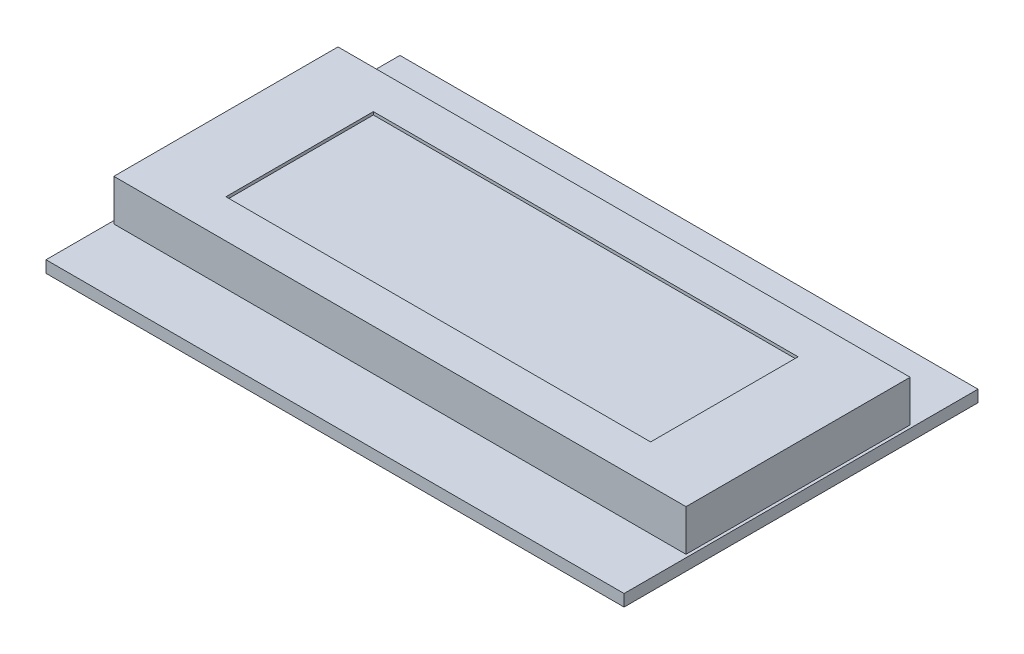
ISO-10303-21;
HEADER;
FILE_DESCRIPTION(('STEP AP214'),'2;1');
FILE_NAME('part.step','',(''),(''),'','','');
FILE_SCHEMA(('AUTOMOTIVE_DESIGN { 1 0 10303 214 1 1 1 1 }'));
ENDSEC;
DATA;
#1=APPLICATION_CONTEXT('core data for automotive mechanical design processes');
#2=APPLICATION_PROTOCOL_DEFINITION('international standard','automotive_design',2000,#1);
#3=PRODUCT_CONTEXT('',#1,'mechanical');
#4=PRODUCT('Part','Part','',(#3));
#5=PRODUCT_RELATED_PRODUCT_CATEGORY('part','',(#4));
#6=PRODUCT_DEFINITION_FORMATION('','',#4);
#7=PRODUCT_DEFINITION_CONTEXT('part definition',#1,'design');
#8=PRODUCT_DEFINITION('design','',#6,#7);
#9=PRODUCT_DEFINITION_SHAPE('','',#8);
#10=(LENGTH_UNIT() NAMED_UNIT(*) SI_UNIT(.MILLI.,.METRE.));
#11=(NAMED_UNIT(*) PLANE_ANGLE_UNIT() SI_UNIT($,.RADIAN.));
#12=(NAMED_UNIT(*) SI_UNIT($,.STERADIAN.) SOLID_ANGLE_UNIT());
#13=UNCERTAINTY_MEASURE_WITH_UNIT(LENGTH_MEASURE(1.E-05),#10,'distance_accuracy_value','');
#14=(GEOMETRIC_REPRESENTATION_CONTEXT(3) GLOBAL_UNCERTAINTY_ASSIGNED_CONTEXT((#13)) GLOBAL_UNIT_ASSIGNED_CONTEXT((#10,
#11,#12)) REPRESENTATION_CONTEXT('',''));
#15=CARTESIAN_POINT('',(0.,0.,0.));
#16=DIRECTION('',(0.,0.,1.));
#17=DIRECTION('',(1.,0.,0.));
#18=AXIS2_PLACEMENT_3D('',#15,#16,#17);
#19=CARTESIAN_POINT('',(0.,2.,0.));
#20=DIRECTION('',(0.,-1.,0.));
#21=DIRECTION('',(0.,0.,-1.));
#22=AXIS2_PLACEMENT_3D('',#19,#20,#21);
#23=PLANE('',#22);
#24=DIRECTION('',(0.,0.,-1.));
#25=VECTOR('',#24,1.);
#26=CARTESIAN_POINT('',(49.0000000000001,2.,30.));
#27=LINE('',#26,#25);
#28=CARTESIAN_POINT('',(49.0000000000001,2.,30.));
#29=VERTEX_POINT('',#28);
#30=CARTESIAN_POINT('',(49.0000000000001,2.,-29.9999999999999));
#31=VERTEX_POINT('',#30);
#32=EDGE_CURVE('E205',#29,#31,#27,.T.);
#33=ORIENTED_EDGE('',*,*,#32,.T.);
#34=DIRECTION('',(-1.,0.,0.));
#35=VECTOR('',#34,1.);
#36=CARTESIAN_POINT('',(-48.9999999999999,2.,-29.9999999999999));
#37=LINE('',#36,#35);
#38=CARTESIAN_POINT('',(-48.9999999999999,2.,-29.9999999999999));
#39=VERTEX_POINT('',#38);
#40=EDGE_CURVE('E208',#31,#39,#37,.T.);
#41=ORIENTED_EDGE('',*,*,#40,.T.);
#42=DIRECTION('',(0.,0.,1.));
#43=VECTOR('',#42,1.);
#44=CARTESIAN_POINT('',(-48.9999999999999,2.,30.));
#45=LINE('',#44,#43);
#46=CARTESIAN_POINT('',(-48.9999999999999,2.,30.));
#47=VERTEX_POINT('',#46);
#48=EDGE_CURVE('E211',#39,#47,#45,.T.);
#49=ORIENTED_EDGE('',*,*,#48,.T.);
#50=DIRECTION('',(1.,0.,0.));
#51=VECTOR('',#50,1.);
#52=CARTESIAN_POINT('',(-48.9999999999999,2.,30.));
#53=LINE('',#52,#51);
#54=EDGE_CURVE('E213',#47,#29,#53,.T.);
#55=ORIENTED_EDGE('',*,*,#54,.T.);
#56=EDGE_LOOP('',(#33,#41,#49,#55));
#57=FACE_BOUND('',#56,.T.);
#58=DIRECTION('',(0.,0.,-1.));
#59=VECTOR('',#58,1.);
#60=CARTESIAN_POINT('',(48.5,2.,19.));
#61=LINE('',#60,#59);
#62=CARTESIAN_POINT('',(48.5,2.,19.));
#63=VERTEX_POINT('',#62);
#64=CARTESIAN_POINT('',(48.5,2.,-19.));
#65=VERTEX_POINT('',#64);
#66=EDGE_CURVE('E70',#63,#65,#61,.T.);
#67=ORIENTED_EDGE('',*,*,#66,.F.);
#68=DIRECTION('',(1.,0.,0.));
#69=VECTOR('',#68,1.);
#70=CARTESIAN_POINT('',(-48.5,2.,19.));
#71=LINE('',#70,#69);
#72=CARTESIAN_POINT('',(-48.5,2.,19.));
#73=VERTEX_POINT('',#72);
#74=EDGE_CURVE('E178',#73,#63,#71,.T.);
#75=ORIENTED_EDGE('',*,*,#74,.F.);
#76=DIRECTION('',(0.,0.,1.));
#77=VECTOR('',#76,1.);
#78=CARTESIAN_POINT('',(-48.5,2.,19.));
#79=LINE('',#78,#77);
#80=CARTESIAN_POINT('',(-48.5,2.,-19.));
#81=VERTEX_POINT('',#80);
#82=EDGE_CURVE('E189',#81,#73,#79,.T.);
#83=ORIENTED_EDGE('',*,*,#82,.F.);
#84=DIRECTION('',(-1.,0.,0.));
#85=VECTOR('',#84,1.);
#86=CARTESIAN_POINT('',(-48.5,2.,-19.));
#87=LINE('',#86,#85);
#88=EDGE_CURVE('E186',#65,#81,#87,.T.);
#89=ORIENTED_EDGE('',*,*,#88,.F.);
#90=EDGE_LOOP('',(#67,#75,#83,#89));
#91=FACE_BOUND('',#90,.T.);
#92=ADVANCED_FACE('F47',(#57,#91),#23,.F.);
#93=CARTESIAN_POINT('',(49.0000000000001,2.,30.));
#94=DIRECTION('',(-1.,0.,0.));
#95=DIRECTION('',(0.,0.,1.));
#96=AXIS2_PLACEMENT_3D('',#93,#94,#95);
#97=PLANE('',#96);
#98=DIRECTION('',(0.,0.,-1.));
#99=VECTOR('',#98,1.);
#100=CARTESIAN_POINT('',(49.0000000000001,0.,30.));
#101=LINE('',#100,#99);
#102=CARTESIAN_POINT('',(49.0000000000001,0.,30.));
#103=VERTEX_POINT('',#102);
#104=CARTESIAN_POINT('',(49.0000000000001,0.,-29.9999999999999));
#105=VERTEX_POINT('',#104);
#106=EDGE_CURVE('E204',#103,#105,#101,.T.);
#107=ORIENTED_EDGE('',*,*,#106,.T.);
#108=DIRECTION('',(0.,-1.,0.));
#109=VECTOR('',#108,1.);
#110=CARTESIAN_POINT('',(49.0000000000001,2.,-29.9999999999999));
#111=LINE('',#110,#109);
#112=EDGE_CURVE('E11',#31,#105,#111,.T.);
#113=ORIENTED_EDGE('',*,*,#112,.F.);
#114=ORIENTED_EDGE('',*,*,#32,.F.);
#115=DIRECTION('',(0.,-1.,0.));
#116=VECTOR('',#115,1.);
#117=CARTESIAN_POINT('',(49.0000000000001,2.,30.));
#118=LINE('',#117,#116);
#119=EDGE_CURVE('E215',#29,#103,#118,.T.);
#120=ORIENTED_EDGE('',*,*,#119,.T.);
#121=EDGE_LOOP('',(#107,#113,#114,#120));
#122=FACE_BOUND('',#121,.T.);
#123=ADVANCED_FACE('F49',(#122),#97,.F.);
#124=CARTESIAN_POINT('',(-48.9999999999999,2.,-29.9999999999999));
#125=DIRECTION('',(0.,0.,1.));
#126=DIRECTION('',(1.,0.,0.));
#127=AXIS2_PLACEMENT_3D('',#124,#125,#126);
#128=PLANE('',#127);
#129=DIRECTION('',(-1.,0.,0.));
#130=VECTOR('',#129,1.);
#131=CARTESIAN_POINT('',(-48.9999999999999,0.,-29.9999999999999));
#132=LINE('',#131,#130);
#133=CARTESIAN_POINT('',(-48.9999999999999,0.,-29.9999999999999));
#134=VERTEX_POINT('',#133);
#135=EDGE_CURVE('E218',#105,#134,#132,.T.);
#136=ORIENTED_EDGE('',*,*,#135,.T.);
#137=DIRECTION('',(0.,-1.,0.));
#138=VECTOR('',#137,1.);
#139=CARTESIAN_POINT('',(-48.9999999999999,2.,-29.9999999999999));
#140=LINE('',#139,#138);
#141=EDGE_CURVE('E55',#39,#134,#140,.T.);
#142=ORIENTED_EDGE('',*,*,#141,.F.);
#143=ORIENTED_EDGE('',*,*,#40,.F.);
#144=ORIENTED_EDGE('',*,*,#112,.T.);
#145=EDGE_LOOP('',(#136,#142,#143,#144));
#146=FACE_BOUND('',#145,.T.);
#147=ADVANCED_FACE('F247',(#146),#128,.F.);
#148=CARTESIAN_POINT('',(-48.9999999999999,2.,30.));
#149=DIRECTION('',(1.,0.,0.));
#150=DIRECTION('',(0.,0.,-1.));
#151=AXIS2_PLACEMENT_3D('',#148,#149,#150);
#152=PLANE('',#151);
#153=DIRECTION('',(0.,0.,1.));
#154=VECTOR('',#153,1.);
#155=CARTESIAN_POINT('',(-48.9999999999999,0.,30.));
#156=LINE('',#155,#154);
#157=CARTESIAN_POINT('',(-48.9999999999999,0.,30.));
#158=VERTEX_POINT('',#157);
#159=EDGE_CURVE('E220',#134,#158,#156,.T.);
#160=ORIENTED_EDGE('',*,*,#159,.T.);
#161=DIRECTION('',(0.,-1.,0.));
#162=VECTOR('',#161,1.);
#163=CARTESIAN_POINT('',(-48.9999999999999,2.,30.));
#164=LINE('',#163,#162);
#165=EDGE_CURVE('E225',#47,#158,#164,.T.);
#166=ORIENTED_EDGE('',*,*,#165,.F.);
#167=ORIENTED_EDGE('',*,*,#48,.F.);
#168=ORIENTED_EDGE('',*,*,#141,.T.);
#169=EDGE_LOOP('',(#160,#166,#167,#168));
#170=FACE_BOUND('',#169,.T.);
#171=ADVANCED_FACE('F232',(#170),#152,.F.);
#172=CARTESIAN_POINT('',(-48.9999999999999,2.,30.));
#173=DIRECTION('',(0.,0.,-1.));
#174=DIRECTION('',(-1.,0.,0.));
#175=AXIS2_PLACEMENT_3D('',#172,#173,#174);
#176=PLANE('',#175);
#177=DIRECTION('',(1.,0.,0.));
#178=VECTOR('',#177,1.);
#179=CARTESIAN_POINT('',(-48.9999999999999,0.,30.));
#180=LINE('',#179,#178);
#181=EDGE_CURVE('E209',#158,#103,#180,.T.);
#182=ORIENTED_EDGE('',*,*,#181,.T.);
#183=ORIENTED_EDGE('',*,*,#119,.F.);
#184=ORIENTED_EDGE('',*,*,#54,.F.);
#185=ORIENTED_EDGE('',*,*,#165,.T.);
#186=EDGE_LOOP('',(#182,#183,#184,#185));
#187=FACE_BOUND('',#186,.T.);
#188=ADVANCED_FACE('F241',(#187),#176,.F.);
#189=CARTESIAN_POINT('',(0.,0.,0.));
#190=DIRECTION('',(0.,-1.,0.));
#191=DIRECTION('',(0.,0.,-1.));
#192=AXIS2_PLACEMENT_3D('',#189,#190,#191);
#193=PLANE('',#192);
#194=ORIENTED_EDGE('',*,*,#106,.F.);
#195=ORIENTED_EDGE('',*,*,#181,.F.);
#196=ORIENTED_EDGE('',*,*,#159,.F.);
#197=ORIENTED_EDGE('',*,*,#135,.F.);
#198=EDGE_LOOP('',(#194,#195,#196,#197));
#199=FACE_BOUND('',#198,.T.);
#200=ADVANCED_FACE('F238',(#199),#193,.T.);
#201=CARTESIAN_POINT('',(48.5,9.,19.));
#202=DIRECTION('',(-1.,0.,0.));
#203=DIRECTION('',(0.,0.,1.));
#204=AXIS2_PLACEMENT_3D('',#201,#202,#203);
#205=PLANE('',#204);
#206=ORIENTED_EDGE('',*,*,#66,.T.);
#207=DIRECTION('',(0.,-1.,0.));
#208=VECTOR('',#207,1.);
#209=CARTESIAN_POINT('',(48.5,9.,-19.));
#210=LINE('',#209,#208);
#211=CARTESIAN_POINT('',(48.5,9.,-19.));
#212=VERTEX_POINT('',#211);
#213=EDGE_CURVE('E201',#212,#65,#210,.T.);
#214=ORIENTED_EDGE('',*,*,#213,.F.);
#215=DIRECTION('',(0.,0.,-1.));
#216=VECTOR('',#215,1.);
#217=CARTESIAN_POINT('',(48.5,9.,19.));
#218=LINE('',#217,#216);
#219=CARTESIAN_POINT('',(48.5,9.,19.));
#220=VERTEX_POINT('',#219);
#221=EDGE_CURVE('E174',#220,#212,#218,.T.);
#222=ORIENTED_EDGE('',*,*,#221,.F.);
#223=DIRECTION('',(0.,-1.,0.));
#224=VECTOR('',#223,1.);
#225=CARTESIAN_POINT('',(48.5,9.,19.));
#226=LINE('',#225,#224);
#227=EDGE_CURVE('E184',#220,#63,#226,.T.);
#228=ORIENTED_EDGE('',*,*,#227,.T.);
#229=EDGE_LOOP('',(#206,#214,#222,#228));
#230=FACE_BOUND('',#229,.T.);
#231=ADVANCED_FACE('F260',(#230),#205,.F.);
#232=CARTESIAN_POINT('',(-48.5,9.,-19.));
#233=DIRECTION('',(0.,0.,1.));
#234=DIRECTION('',(1.,0.,0.));
#235=AXIS2_PLACEMENT_3D('',#232,#233,#234);
#236=PLANE('',#235);
#237=ORIENTED_EDGE('',*,*,#88,.T.);
#238=DIRECTION('',(0.,-1.,0.));
#239=VECTOR('',#238,1.);
#240=CARTESIAN_POINT('',(-48.5,9.,-19.));
#241=LINE('',#240,#239);
#242=CARTESIAN_POINT('',(-48.5,9.,-19.));
#243=VERTEX_POINT('',#242);
#244=EDGE_CURVE('E198',#243,#81,#241,.T.);
#245=ORIENTED_EDGE('',*,*,#244,.F.);
#246=DIRECTION('',(-1.,0.,0.));
#247=VECTOR('',#246,1.);
#248=CARTESIAN_POINT('',(-48.5,9.,-19.));
#249=LINE('',#248,#247);
#250=EDGE_CURVE('E177',#212,#243,#249,.T.);
#251=ORIENTED_EDGE('',*,*,#250,.F.);
#252=ORIENTED_EDGE('',*,*,#213,.T.);
#253=EDGE_LOOP('',(#237,#245,#251,#252));
#254=FACE_BOUND('',#253,.T.);
#255=ADVANCED_FACE('F279',(#254),#236,.F.);
#256=CARTESIAN_POINT('',(-48.5,9.,19.));
#257=DIRECTION('',(1.,0.,0.));
#258=DIRECTION('',(0.,0.,-1.));
#259=AXIS2_PLACEMENT_3D('',#256,#257,#258);
#260=PLANE('',#259);
#261=ORIENTED_EDGE('',*,*,#82,.T.);
#262=DIRECTION('',(0.,-1.,0.));
#263=VECTOR('',#262,1.);
#264=CARTESIAN_POINT('',(-48.5,9.,19.));
#265=LINE('',#264,#263);
#266=CARTESIAN_POINT('',(-48.5,9.,19.));
#267=VERTEX_POINT('',#266);
#268=EDGE_CURVE('E195',#267,#73,#265,.T.);
#269=ORIENTED_EDGE('',*,*,#268,.F.);
#270=DIRECTION('',(0.,0.,1.));
#271=VECTOR('',#270,1.);
#272=CARTESIAN_POINT('',(-48.5,9.,19.));
#273=LINE('',#272,#271);
#274=EDGE_CURVE('E180',#243,#267,#273,.T.);
#275=ORIENTED_EDGE('',*,*,#274,.F.);
#276=ORIENTED_EDGE('',*,*,#244,.T.);
#277=EDGE_LOOP('',(#261,#269,#275,#276));
#278=FACE_BOUND('',#277,.T.);
#279=ADVANCED_FACE('F286',(#278),#260,.F.);
#280=CARTESIAN_POINT('',(-48.5,9.,19.));
#281=DIRECTION('',(0.,0.,-1.));
#282=DIRECTION('',(-1.,0.,0.));
#283=AXIS2_PLACEMENT_3D('',#280,#281,#282);
#284=PLANE('',#283);
#285=ORIENTED_EDGE('',*,*,#74,.T.);
#286=ORIENTED_EDGE('',*,*,#227,.F.);
#287=DIRECTION('',(1.,0.,0.));
#288=VECTOR('',#287,1.);
#289=CARTESIAN_POINT('',(-48.5,9.,19.));
#290=LINE('',#289,#288);
#291=EDGE_CURVE('E182',#267,#220,#290,.T.);
#292=ORIENTED_EDGE('',*,*,#291,.F.);
#293=ORIENTED_EDGE('',*,*,#268,.T.);
#294=EDGE_LOOP('',(#285,#286,#292,#293));
#295=FACE_BOUND('',#294,.T.);
#296=ADVANCED_FACE('F293',(#295),#284,.F.);
#297=CARTESIAN_POINT('',(0.,9.,0.));
#298=DIRECTION('',(0.,-1.,0.));
#299=DIRECTION('',(0.,0.,-1.));
#300=AXIS2_PLACEMENT_3D('',#297,#298,#299);
#301=PLANE('',#300);
#302=DIRECTION('',(-1.,0.,0.));
#303=VECTOR('',#302,1.);
#304=CARTESIAN_POINT('',(-36.,9.,-12.5));
#305=LINE('',#304,#303);
#306=CARTESIAN_POINT('',(36.,9.,-12.5));
#307=VERTEX_POINT('',#306);
#308=CARTESIAN_POINT('',(-36.,9.,-12.5));
#309=VERTEX_POINT('',#308);
#310=EDGE_CURVE('E165',#307,#309,#305,.T.);
#311=ORIENTED_EDGE('',*,*,#310,.F.);
#312=DIRECTION('',(0.,0.,-1.));
#313=VECTOR('',#312,1.);
#314=CARTESIAN_POINT('',(36.,9.,12.5));
#315=LINE('',#314,#313);
#316=CARTESIAN_POINT('',(36.,9.,12.5));
#317=VERTEX_POINT('',#316);
#318=EDGE_CURVE('E62',#317,#307,#315,.T.);
#319=ORIENTED_EDGE('',*,*,#318,.F.);
#320=DIRECTION('',(1.,0.,0.));
#321=VECTOR('',#320,1.);
#322=CARTESIAN_POINT('',(-36.,9.,12.5));
#323=LINE('',#322,#321);
#324=CARTESIAN_POINT('',(-36.,9.,12.5));
#325=VERTEX_POINT('',#324);
#326=EDGE_CURVE('E156',#325,#317,#323,.T.);
#327=ORIENTED_EDGE('',*,*,#326,.F.);
#328=DIRECTION('',(0.,0.,1.));
#329=VECTOR('',#328,1.);
#330=CARTESIAN_POINT('',(-36.,9.,12.5));
#331=LINE('',#330,#329);
#332=EDGE_CURVE('E159',#309,#325,#331,.T.);
#333=ORIENTED_EDGE('',*,*,#332,.F.);
#334=EDGE_LOOP('',(#311,#319,#327,#333));
#335=FACE_BOUND('',#334,.T.);
#336=ORIENTED_EDGE('',*,*,#221,.T.);
#337=ORIENTED_EDGE('',*,*,#250,.T.);
#338=ORIENTED_EDGE('',*,*,#274,.T.);
#339=ORIENTED_EDGE('',*,*,#291,.T.);
#340=EDGE_LOOP('',(#336,#337,#338,#339));
#341=FACE_BOUND('',#340,.T.);
#342=ADVANCED_FACE('F301',(#335,#341),#301,.F.);
#343=CARTESIAN_POINT('',(36.,8.5,12.5));
#344=DIRECTION('',(1.,0.,0.));
#345=DIRECTION('',(0.,0.,-1.));
#346=AXIS2_PLACEMENT_3D('',#343,#344,#345);
#347=PLANE('',#346);
#348=ORIENTED_EDGE('',*,*,#318,.T.);
#349=DIRECTION('',(0.,1.,0.));
#350=VECTOR('',#349,1.);
#351=CARTESIAN_POINT('',(36.,8.5,-12.5));
#352=LINE('',#351,#350);
#353=CARTESIAN_POINT('',(36.,8.5,-12.5));
#354=VERTEX_POINT('',#353);
#355=EDGE_CURVE('E134',#354,#307,#352,.T.);
#356=ORIENTED_EDGE('',*,*,#355,.F.);
#357=DIRECTION('',(0.,0.,-1.));
#358=VECTOR('',#357,1.);
#359=CARTESIAN_POINT('',(36.,8.5,12.5));
#360=LINE('',#359,#358);
#361=CARTESIAN_POINT('',(36.,8.5,12.5));
#362=VERTEX_POINT('',#361);
#363=EDGE_CURVE('E138',#362,#354,#360,.T.);
#364=ORIENTED_EDGE('',*,*,#363,.F.);
#365=DIRECTION('',(0.,1.,0.));
#366=VECTOR('',#365,1.);
#367=CARTESIAN_POINT('',(36.,8.5,12.5));
#368=LINE('',#367,#366);
#369=EDGE_CURVE('E169',#362,#317,#368,.T.);
#370=ORIENTED_EDGE('',*,*,#369,.T.);
#371=EDGE_LOOP('',(#348,#356,#364,#370));
#372=FACE_BOUND('',#371,.T.);
#373=ADVANCED_FACE('F136',(#372),#347,.F.);
#374=CARTESIAN_POINT('',(-36.,8.5,12.5));
#375=DIRECTION('',(0.,0.,1.));
#376=DIRECTION('',(1.,0.,0.));
#377=AXIS2_PLACEMENT_3D('',#374,#375,#376);
#378=PLANE('',#377);
#379=ORIENTED_EDGE('',*,*,#326,.T.);
#380=ORIENTED_EDGE('',*,*,#369,.F.);
#381=DIRECTION('',(1.,0.,0.));
#382=VECTOR('',#381,1.);
#383=CARTESIAN_POINT('',(-36.,8.5,12.5));
#384=LINE('',#383,#382);
#385=CARTESIAN_POINT('',(-36.,8.5,12.5));
#386=VERTEX_POINT('',#385);
#387=EDGE_CURVE('E144',#386,#362,#384,.T.);
#388=ORIENTED_EDGE('',*,*,#387,.F.);
#389=DIRECTION('',(0.,1.,0.));
#390=VECTOR('',#389,1.);
#391=CARTESIAN_POINT('',(-36.,8.5,12.5));
#392=LINE('',#391,#390);
#393=EDGE_CURVE('E171',#386,#325,#392,.T.);
#394=ORIENTED_EDGE('',*,*,#393,.T.);
#395=EDGE_LOOP('',(#379,#380,#388,#394));
#396=FACE_BOUND('',#395,.T.);
#397=ADVANCED_FACE('F316',(#396),#378,.F.);
#398=CARTESIAN_POINT('',(-36.,8.5,12.5));
#399=DIRECTION('',(-1.,0.,0.));
#400=DIRECTION('',(0.,0.,1.));
#401=AXIS2_PLACEMENT_3D('',#398,#399,#400);
#402=PLANE('',#401);
#403=ORIENTED_EDGE('',*,*,#332,.T.);
#404=ORIENTED_EDGE('',*,*,#393,.F.);
#405=DIRECTION('',(0.,0.,1.));
#406=VECTOR('',#405,1.);
#407=CARTESIAN_POINT('',(-36.,8.5,12.5));
#408=LINE('',#407,#406);
#409=CARTESIAN_POINT('',(-36.,8.5,-12.5));
#410=VERTEX_POINT('',#409);
#411=EDGE_CURVE('E152',#410,#386,#408,.T.);
#412=ORIENTED_EDGE('',*,*,#411,.F.);
#413=DIRECTION('',(0.,1.,0.));
#414=VECTOR('',#413,1.);
#415=CARTESIAN_POINT('',(-36.,8.5,-12.5));
#416=LINE('',#415,#414);
#417=EDGE_CURVE('E143',#410,#309,#416,.T.);
#418=ORIENTED_EDGE('',*,*,#417,.T.);
#419=EDGE_LOOP('',(#403,#404,#412,#418));
#420=FACE_BOUND('',#419,.T.);
#421=ADVANCED_FACE('F323',(#420),#402,.F.);
#422=CARTESIAN_POINT('',(-36.,8.5,-12.5));
#423=DIRECTION('',(0.,0.,-1.));
#424=DIRECTION('',(-1.,0.,0.));
#425=AXIS2_PLACEMENT_3D('',#422,#423,#424);
#426=PLANE('',#425);
#427=ORIENTED_EDGE('',*,*,#310,.T.);
#428=ORIENTED_EDGE('',*,*,#417,.F.);
#429=DIRECTION('',(-1.,0.,0.));
#430=VECTOR('',#429,1.);
#431=CARTESIAN_POINT('',(-36.,8.5,-12.5));
#432=LINE('',#431,#430);
#433=EDGE_CURVE('E147',#354,#410,#432,.T.);
#434=ORIENTED_EDGE('',*,*,#433,.F.);
#435=ORIENTED_EDGE('',*,*,#355,.T.);
#436=EDGE_LOOP('',(#427,#428,#434,#435));
#437=FACE_BOUND('',#436,.T.);
#438=ADVANCED_FACE('F148',(#437),#426,.F.);
#439=CARTESIAN_POINT('',(0.,8.5,0.));
#440=DIRECTION('',(0.,-1.,0.));
#441=DIRECTION('',(0.,0.,-1.));
#442=AXIS2_PLACEMENT_3D('',#439,#440,#441);
#443=PLANE('',#442);
#444=ORIENTED_EDGE('',*,*,#363,.T.);
#445=ORIENTED_EDGE('',*,*,#433,.T.);
#446=ORIENTED_EDGE('',*,*,#411,.T.);
#447=ORIENTED_EDGE('',*,*,#387,.T.);
#448=EDGE_LOOP('',(#444,#445,#446,#447));
#449=FACE_BOUND('',#448,.T.);
#450=ADVANCED_FACE('F154',(#449),#443,.F.);
#451=CLOSED_SHELL('',(#92,#123,#147,#171,#188,#200,#231,#255,#279,#296,#342,#373,#397,#421,#438,#450));
#452=MANIFOLD_SOLID_BREP('B2',#451);
#453=ADVANCED_BREP_SHAPE_REPRESENTATION('',(#18,#452),#14);
#454=SHAPE_DEFINITION_REPRESENTATION(#9,#453);
ENDSEC;
END-ISO-10303-21;
